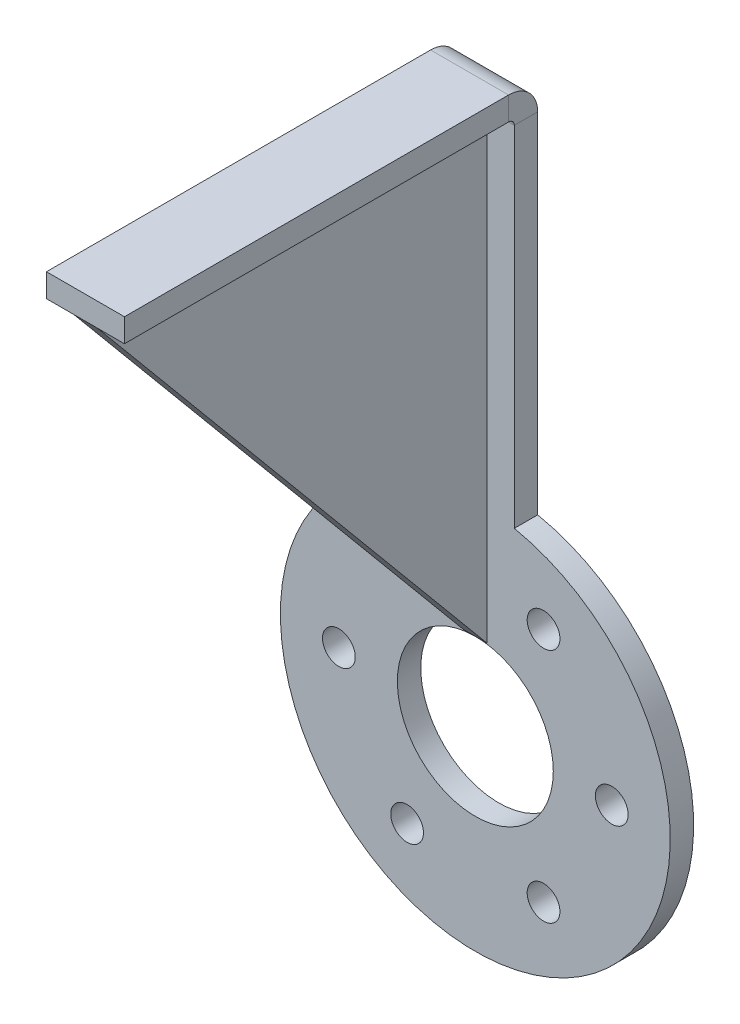
ISO-10303-21;
HEADER;
FILE_DESCRIPTION(('STEP AP214'),'2;1');
FILE_NAME('part.step','',(''),(''),'','','');
FILE_SCHEMA(('AUTOMOTIVE_DESIGN { 1 0 10303 214 1 1 1 1 }'));
ENDSEC;
DATA;
#1=APPLICATION_CONTEXT('core data for automotive mechanical design processes');
#2=APPLICATION_PROTOCOL_DEFINITION('international standard','automotive_design',2000,#1);
#3=PRODUCT_CONTEXT('',#1,'mechanical');
#4=PRODUCT('Part','Part','',(#3));
#5=PRODUCT_RELATED_PRODUCT_CATEGORY('part','',(#4));
#6=PRODUCT_DEFINITION_FORMATION('','',#4);
#7=PRODUCT_DEFINITION_CONTEXT('part definition',#1,'design');
#8=PRODUCT_DEFINITION('design','',#6,#7);
#9=PRODUCT_DEFINITION_SHAPE('','',#8);
#10=(LENGTH_UNIT() NAMED_UNIT(*) SI_UNIT(.MILLI.,.METRE.));
#11=(NAMED_UNIT(*) PLANE_ANGLE_UNIT() SI_UNIT($,.RADIAN.));
#12=(NAMED_UNIT(*) SI_UNIT($,.STERADIAN.) SOLID_ANGLE_UNIT());
#13=UNCERTAINTY_MEASURE_WITH_UNIT(LENGTH_MEASURE(1.E-05),#10,'distance_accuracy_value','');
#14=(GEOMETRIC_REPRESENTATION_CONTEXT(3) GLOBAL_UNCERTAINTY_ASSIGNED_CONTEXT((#13)) GLOBAL_UNIT_ASSIGNED_CONTEXT((#10,
#11,#12)) REPRESENTATION_CONTEXT('',''));
#15=CARTESIAN_POINT('',(0.,0.,0.));
#16=DIRECTION('',(0.,0.,1.));
#17=DIRECTION('',(1.,0.,0.));
#18=AXIS2_PLACEMENT_3D('',#15,#16,#17);
#19=CARTESIAN_POINT('',(0.,0.,0.));
#20=DIRECTION('',(0.,0.,1.));
#21=DIRECTION('',(1.,0.,0.));
#22=AXIS2_PLACEMENT_3D('',#19,#20,#21);
#23=PLANE('',#22);
#24=CARTESIAN_POINT('',(8.75000000000018,-15.1554445662276,0.));
#25=DIRECTION('',(0.,0.,1.));
#26=DIRECTION('',(1.,0.,0.));
#27=AXIS2_PLACEMENT_3D('',#24,#25,#26);
#28=CIRCLE('',#27,2.09999999999999);
#29=CARTESIAN_POINT('',(10.8500000000002,-15.1554445662276,0.));
#30=VERTEX_POINT('',#29);
#31=EDGE_CURVE('E324',#30,#30,#28,.T.);
#32=ORIENTED_EDGE('',*,*,#31,.F.);
#33=EDGE_LOOP('',(#32));
#34=FACE_BOUND('',#33,.T.);
#35=CARTESIAN_POINT('',(-8.74999999999986,-15.1554445662278,0.));
#36=DIRECTION('',(0.,0.,1.));
#37=DIRECTION('',(1.,0.,0.));
#38=AXIS2_PLACEMENT_3D('',#35,#36,#37);
#39=CIRCLE('',#38,2.09999999999999);
#40=CARTESIAN_POINT('',(-6.64999999999987,-15.1554445662278,0.));
#41=VERTEX_POINT('',#40);
#42=EDGE_CURVE('E318',#41,#41,#39,.T.);
#43=ORIENTED_EDGE('',*,*,#42,.F.);
#44=EDGE_LOOP('',(#43));
#45=FACE_BOUND('',#44,.T.);
#46=CARTESIAN_POINT('',(-17.5,0.,0.));
#47=DIRECTION('',(0.,0.,1.));
#48=DIRECTION('',(1.,0.,0.));
#49=AXIS2_PLACEMENT_3D('',#46,#47,#48);
#50=CIRCLE('',#49,2.09999999999999);
#51=CARTESIAN_POINT('',(-15.4,0.,0.));
#52=VERTEX_POINT('',#51);
#53=EDGE_CURVE('E312',#52,#52,#50,.T.);
#54=ORIENTED_EDGE('',*,*,#53,.F.);
#55=EDGE_LOOP('',(#54));
#56=FACE_BOUND('',#55,.T.);
#57=CARTESIAN_POINT('',(-8.75000000000007,15.1554445662276,0.));
#58=DIRECTION('',(0.,0.,1.));
#59=DIRECTION('',(1.,0.,0.));
#60=AXIS2_PLACEMENT_3D('',#57,#58,#59);
#61=CIRCLE('',#60,2.09999999999999);
#62=CARTESIAN_POINT('',(-6.65000000000009,15.1554445662276,0.));
#63=VERTEX_POINT('',#62);
#64=EDGE_CURVE('E306',#63,#63,#61,.T.);
#65=ORIENTED_EDGE('',*,*,#64,.F.);
#66=EDGE_LOOP('',(#65));
#67=FACE_BOUND('',#66,.T.);
#68=CARTESIAN_POINT('',(8.74999999999996,15.1554445662277,0.));
#69=DIRECTION('',(0.,0.,1.));
#70=DIRECTION('',(1.,0.,0.));
#71=AXIS2_PLACEMENT_3D('',#68,#69,#70);
#72=CIRCLE('',#71,2.09999999999999);
#73=CARTESIAN_POINT('',(10.85,15.1554445662277,0.));
#74=VERTEX_POINT('',#73);
#75=EDGE_CURVE('E300',#74,#74,#72,.T.);
#76=ORIENTED_EDGE('',*,*,#75,.F.);
#77=EDGE_LOOP('',(#76));
#78=FACE_BOUND('',#77,.T.);
#79=CARTESIAN_POINT('',(17.5,0.,0.));
#80=DIRECTION('',(0.,0.,1.));
#81=DIRECTION('',(1.,0.,0.));
#82=AXIS2_PLACEMENT_3D('',#79,#80,#81);
#83=CIRCLE('',#82,2.09999999999999);
#84=CARTESIAN_POINT('',(19.6,0.,0.));
#85=VERTEX_POINT('',#84);
#86=EDGE_CURVE('E289',#85,#85,#83,.T.);
#87=ORIENTED_EDGE('',*,*,#86,.F.);
#88=EDGE_LOOP('',(#87));
#89=FACE_BOUND('',#88,.T.);
#90=DIRECTION('',(0.,1.,0.));
#91=VECTOR('',#90,1.);
#92=CARTESIAN_POINT('',(4.99999999999999,70.,0.));
#93=LINE('',#92,#91);
#94=CARTESIAN_POINT('',(4.99999999999999,24.4948974278318,0.));
#95=VERTEX_POINT('',#94);
#96=CARTESIAN_POINT('',(4.99999999999999,69.2634,0.));
#97=VERTEX_POINT('',#96);
#98=EDGE_CURVE('E231',#95,#97,#93,.T.);
#99=ORIENTED_EDGE('',*,*,#98,.T.);
#100=DIRECTION('',(-1.,0.,0.));
#101=VECTOR('',#100,1.);
#102=CARTESIAN_POINT('',(-5.00000000000001,69.2634,0.));
#103=LINE('',#102,#101);
#104=CARTESIAN_POINT('',(-5.00000000000001,69.2634,0.));
#105=VERTEX_POINT('',#104);
#106=EDGE_CURVE('E211',#105,#97,#103,.F.);
#107=ORIENTED_EDGE('',*,*,#106,.F.);
#108=DIRECTION('',(0.,-1.,0.));
#109=VECTOR('',#108,1.);
#110=CARTESIAN_POINT('',(-5.00000000000001,70.,0.));
#111=LINE('',#110,#109);
#112=CARTESIAN_POINT('',(-5.,24.4948974278318,0.));
#113=VERTEX_POINT('',#112);
#114=EDGE_CURVE('E225',#105,#113,#111,.T.);
#115=ORIENTED_EDGE('',*,*,#114,.T.);
#116=CARTESIAN_POINT('',(0.,0.,0.));
#117=DIRECTION('',(0.,0.,1.));
#118=DIRECTION('',(1.,0.,0.));
#119=AXIS2_PLACEMENT_3D('',#116,#117,#118);
#120=CIRCLE('',#119,25.);
#121=EDGE_CURVE('E238',#113,#95,#120,.T.);
#122=ORIENTED_EDGE('',*,*,#121,.T.);
#123=EDGE_LOOP('',(#99,#107,#115,#122));
#124=FACE_BOUND('',#123,.T.);
#125=DIRECTION('',(1.,0.,0.));
#126=VECTOR('',#125,1.);
#127=CARTESIAN_POINT('',(-1.50000000000001,10.0000000000002,0.));
#128=LINE('',#127,#126);
#129=CARTESIAN_POINT('',(-1.50000000000001,10.0000000000002,0.));
#130=VERTEX_POINT('',#129);
#131=CARTESIAN_POINT('',(0.,10.,0.));
#132=VERTEX_POINT('',#131);
#133=EDGE_CURVE('E60',#130,#132,#128,.T.);
#134=ORIENTED_EDGE('',*,*,#133,.F.);
#135=DIRECTION('',(0.,1.,0.));
#136=VECTOR('',#135,1.);
#137=CARTESIAN_POINT('',(-1.50000000000001,10.0000000000002,0.));
#138=LINE('',#137,#136);
#139=CARTESIAN_POINT('',(-1.50000000000001,69.2600000000002,0.));
#140=VERTEX_POINT('',#139);
#141=EDGE_CURVE('E64',#130,#140,#138,.T.);
#142=ORIENTED_EDGE('',*,*,#141,.T.);
#143=DIRECTION('',(1.,0.,0.));
#144=VECTOR('',#143,1.);
#145=CARTESIAN_POINT('',(-1.50000000000001,69.2600000000002,0.));
#146=LINE('',#145,#144);
#147=CARTESIAN_POINT('',(1.49999999999999,69.2600000000002,0.));
#148=VERTEX_POINT('',#147);
#149=EDGE_CURVE('E141',#140,#148,#146,.T.);
#150=ORIENTED_EDGE('',*,*,#149,.T.);
#151=DIRECTION('',(0.,1.,0.));
#152=VECTOR('',#151,1.);
#153=CARTESIAN_POINT('',(1.49999999999999,10.0000000000002,0.));
#154=LINE('',#153,#152);
#155=CARTESIAN_POINT('',(1.49999999999999,10.0000000000002,0.));
#156=VERTEX_POINT('',#155);
#157=EDGE_CURVE('E283',#156,#148,#154,.T.);
#158=ORIENTED_EDGE('',*,*,#157,.F.);
#159=EDGE_CURVE('E153',#132,#156,#128,.T.);
#160=ORIENTED_EDGE('',*,*,#159,.F.);
#161=CARTESIAN_POINT('',(0.,0.,0.));
#162=DIRECTION('',(0.,0.,1.));
#163=DIRECTION('',(1.,0.,0.));
#164=AXIS2_PLACEMENT_3D('',#161,#162,#163);
#165=CIRCLE('',#164,10.);
#166=EDGE_CURVE('E219',#132,#132,#165,.T.);
#167=ORIENTED_EDGE('',*,*,#166,.F.);
#168=EDGE_LOOP('',(#134,#142,#150,#158,#160,#167));
#169=FACE_BOUND('',#168,.T.);
#170=ADVANCED_FACE('F45',(#34,#45,#56,#67,#78,#89,#124,#169),#23,.T.);
#171=CARTESIAN_POINT('',(0.,70.,-2.52575738102223E-13));
#172=DIRECTION('',(0.,-1.,0.));
#173=DIRECTION('',(0.,0.,-1.));
#174=AXIS2_PLACEMENT_3D('',#171,#172,#173);
#175=PLANE('',#174);
#176=DIRECTION('',(1.,0.,0.));
#177=VECTOR('',#176,1.);
#178=CARTESIAN_POINT('',(-1.50000000000001,70.0000000000002,0.740000000000005));
#179=LINE('',#178,#177);
#180=CARTESIAN_POINT('',(-1.50000000000001,70.0000000000002,0.740000000000005));
#181=VERTEX_POINT('',#180);
#182=CARTESIAN_POINT('',(1.49999999999999,70.0000000000002,0.740000000000005));
#183=VERTEX_POINT('',#182);
#184=EDGE_CURVE('E139',#181,#183,#179,.T.);
#185=ORIENTED_EDGE('',*,*,#184,.F.);
#186=DIRECTION('',(0.,0.,1.));
#187=VECTOR('',#186,1.);
#188=CARTESIAN_POINT('',(-1.50000000000001,70.0000000000002,50.));
#189=LINE('',#188,#187);
#190=CARTESIAN_POINT('',(-1.50000000000001,70.0000000000002,50.));
#191=VERTEX_POINT('',#190);
#192=EDGE_CURVE('E143',#181,#191,#189,.T.);
#193=ORIENTED_EDGE('',*,*,#192,.T.);
#194=DIRECTION('',(1.,0.,0.));
#195=VECTOR('',#194,1.);
#196=CARTESIAN_POINT('',(4.99999999999999,70.0000000000002,50.));
#197=LINE('',#196,#195);
#198=CARTESIAN_POINT('',(-5.00000000000001,70.0000000000002,50.));
#199=VERTEX_POINT('',#198);
#200=EDGE_CURVE('E182',#199,#191,#197,.T.);
#201=ORIENTED_EDGE('',*,*,#200,.F.);
#202=DIRECTION('',(0.,0.,1.));
#203=VECTOR('',#202,1.);
#204=CARTESIAN_POINT('',(-5.00000000000001,70.0000000000002,50.));
#205=LINE('',#204,#203);
#206=CARTESIAN_POINT('',(-5.00000000000001,70.,0.736600000000004));
#207=VERTEX_POINT('',#206);
#208=EDGE_CURVE('E189',#207,#199,#205,.T.);
#209=ORIENTED_EDGE('',*,*,#208,.F.);
#210=DIRECTION('',(-1.,0.,0.));
#211=VECTOR('',#210,1.);
#212=CARTESIAN_POINT('',(4.99999999999999,70.,0.736600000000004));
#213=LINE('',#212,#211);
#214=CARTESIAN_POINT('',(4.99999999999999,70.,0.736600000000004));
#215=VERTEX_POINT('',#214);
#216=EDGE_CURVE('E168',#215,#207,#213,.T.);
#217=ORIENTED_EDGE('',*,*,#216,.F.);
#218=DIRECTION('',(0.,0.,-1.));
#219=VECTOR('',#218,1.);
#220=CARTESIAN_POINT('',(4.99999999999999,70.,0.));
#221=LINE('',#220,#219);
#222=CARTESIAN_POINT('',(4.99999999999999,70.0000000000002,50.));
#223=VERTEX_POINT('',#222);
#224=EDGE_CURVE('E177',#223,#215,#221,.T.);
#225=ORIENTED_EDGE('',*,*,#224,.F.);
#226=CARTESIAN_POINT('',(1.49999999999999,70.0000000000002,50.));
#227=VERTEX_POINT('',#226);
#228=EDGE_CURVE('E191',#227,#223,#197,.T.);
#229=ORIENTED_EDGE('',*,*,#228,.F.);
#230=DIRECTION('',(0.,0.,1.));
#231=VECTOR('',#230,1.);
#232=CARTESIAN_POINT('',(1.49999999999999,70.0000000000002,50.));
#233=LINE('',#232,#231);
#234=EDGE_CURVE('E158',#183,#227,#233,.T.);
#235=ORIENTED_EDGE('',*,*,#234,.F.);
#236=EDGE_LOOP('',(#185,#193,#201,#209,#217,#225,#229,#235));
#237=FACE_BOUND('',#236,.T.);
#238=ADVANCED_FACE('F156',(#237),#175,.T.);
#239=CARTESIAN_POINT('',(-5.00000000000001,70.,-3.));
#240=DIRECTION('',(-1.,0.,0.));
#241=DIRECTION('',(0.,0.,1.));
#242=AXIS2_PLACEMENT_3D('',#239,#240,#241);
#243=PLANE('',#242);
#244=ORIENTED_EDGE('',*,*,#114,.F.);
#245=DIRECTION('',(0.,0.,-1.));
#246=VECTOR('',#245,1.);
#247=CARTESIAN_POINT('',(-5.00000000000001,69.2634,0.));
#248=LINE('',#247,#246);
#249=CARTESIAN_POINT('',(-5.00000000000001,69.2634,-3.));
#250=VERTEX_POINT('',#249);
#251=EDGE_CURVE('E205',#105,#250,#248,.T.);
#252=ORIENTED_EDGE('',*,*,#251,.T.);
#253=DIRECTION('',(0.,-1.,0.));
#254=VECTOR('',#253,1.);
#255=CARTESIAN_POINT('',(-5.00000000000001,70.,-3.));
#256=LINE('',#255,#254);
#257=CARTESIAN_POINT('',(-5.,24.4948974278318,-3.));
#258=VERTEX_POINT('',#257);
#259=EDGE_CURVE('E228',#250,#258,#256,.T.);
#260=ORIENTED_EDGE('',*,*,#259,.T.);
#261=DIRECTION('',(0.,0.,1.));
#262=VECTOR('',#261,1.);
#263=CARTESIAN_POINT('',(-5.,24.4948974278318,-3.));
#264=LINE('',#263,#262);
#265=EDGE_CURVE('E49',#258,#113,#264,.T.);
#266=ORIENTED_EDGE('',*,*,#265,.T.);
#267=EDGE_LOOP('',(#244,#252,#260,#266));
#268=FACE_BOUND('',#267,.T.);
#269=ADVANCED_FACE('F47',(#268),#243,.T.);
#270=CARTESIAN_POINT('',(0.,0.,-3.));
#271=DIRECTION('',(0.,0.,1.));
#272=DIRECTION('',(1.,0.,0.));
#273=AXIS2_PLACEMENT_3D('',#270,#271,#272);
#274=PLANE('',#273);
#275=CARTESIAN_POINT('',(8.75000000000018,-15.1554445662276,-3.));
#276=DIRECTION('',(0.,0.,1.));
#277=DIRECTION('',(1.,0.,0.));
#278=AXIS2_PLACEMENT_3D('',#275,#276,#277);
#279=CIRCLE('',#278,2.09999999999996);
#280=CARTESIAN_POINT('',(10.8500000000001,-15.1554445662276,-3.));
#281=VERTEX_POINT('',#280);
#282=EDGE_CURVE('E321',#281,#281,#279,.T.);
#283=ORIENTED_EDGE('',*,*,#282,.T.);
#284=EDGE_LOOP('',(#283));
#285=FACE_BOUND('',#284,.T.);
#286=CARTESIAN_POINT('',(-8.74999999999986,-15.1554445662278,-3.));
#287=DIRECTION('',(0.,0.,1.));
#288=DIRECTION('',(1.,0.,0.));
#289=AXIS2_PLACEMENT_3D('',#286,#287,#288);
#290=CIRCLE('',#289,2.09999999999996);
#291=CARTESIAN_POINT('',(-6.6499999999999,-15.1554445662278,-3.));
#292=VERTEX_POINT('',#291);
#293=EDGE_CURVE('E315',#292,#292,#290,.T.);
#294=ORIENTED_EDGE('',*,*,#293,.T.);
#295=EDGE_LOOP('',(#294));
#296=FACE_BOUND('',#295,.T.);
#297=CARTESIAN_POINT('',(-17.5,0.,-3.));
#298=DIRECTION('',(0.,0.,1.));
#299=DIRECTION('',(1.,0.,0.));
#300=AXIS2_PLACEMENT_3D('',#297,#298,#299);
#301=CIRCLE('',#300,2.09999999999996);
#302=CARTESIAN_POINT('',(-15.4,0.,-3.));
#303=VERTEX_POINT('',#302);
#304=EDGE_CURVE('E309',#303,#303,#301,.T.);
#305=ORIENTED_EDGE('',*,*,#304,.T.);
#306=EDGE_LOOP('',(#305));
#307=FACE_BOUND('',#306,.T.);
#308=CARTESIAN_POINT('',(-8.75000000000007,15.1554445662276,-3.));
#309=DIRECTION('',(0.,0.,1.));
#310=DIRECTION('',(1.,0.,0.));
#311=AXIS2_PLACEMENT_3D('',#308,#309,#310);
#312=CIRCLE('',#311,2.09999999999996);
#313=CARTESIAN_POINT('',(-6.65000000000011,15.1554445662276,-3.));
#314=VERTEX_POINT('',#313);
#315=EDGE_CURVE('E303',#314,#314,#312,.T.);
#316=ORIENTED_EDGE('',*,*,#315,.T.);
#317=EDGE_LOOP('',(#316));
#318=FACE_BOUND('',#317,.T.);
#319=CARTESIAN_POINT('',(8.74999999999996,15.1554445662277,-3.));
#320=DIRECTION('',(0.,0.,1.));
#321=DIRECTION('',(1.,0.,0.));
#322=AXIS2_PLACEMENT_3D('',#319,#320,#321);
#323=CIRCLE('',#322,2.09999999999996);
#324=CARTESIAN_POINT('',(10.8499999999999,15.1554445662277,-3.));
#325=VERTEX_POINT('',#324);
#326=EDGE_CURVE('E297',#325,#325,#323,.T.);
#327=ORIENTED_EDGE('',*,*,#326,.T.);
#328=EDGE_LOOP('',(#327));
#329=FACE_BOUND('',#328,.T.);
#330=CARTESIAN_POINT('',(17.5,0.,-3.));
#331=DIRECTION('',(0.,0.,1.));
#332=DIRECTION('',(1.,0.,0.));
#333=AXIS2_PLACEMENT_3D('',#330,#331,#332);
#334=CIRCLE('',#333,2.09999999999996);
#335=CARTESIAN_POINT('',(19.6,0.,-3.));
#336=VERTEX_POINT('',#335);
#337=EDGE_CURVE('E284',#336,#336,#334,.T.);
#338=ORIENTED_EDGE('',*,*,#337,.T.);
#339=EDGE_LOOP('',(#338));
#340=FACE_BOUND('',#339,.T.);
#341=CARTESIAN_POINT('',(0.,0.,-3.));
#342=DIRECTION('',(0.,0.,1.));
#343=DIRECTION('',(1.,0.,0.));
#344=AXIS2_PLACEMENT_3D('',#341,#342,#343);
#345=CIRCLE('',#344,10.);
#346=CARTESIAN_POINT('',(10.,0.,-3.));
#347=VERTEX_POINT('',#346);
#348=EDGE_CURVE('E222',#347,#347,#345,.T.);
#349=ORIENTED_EDGE('',*,*,#348,.T.);
#350=EDGE_LOOP('',(#349));
#351=FACE_BOUND('',#350,.T.);
#352=DIRECTION('',(-1.,0.,0.));
#353=VECTOR('',#352,1.);
#354=CARTESIAN_POINT('',(-5.00000000000001,69.2634,-3.));
#355=LINE('',#354,#353);
#356=CARTESIAN_POINT('',(4.99999999999999,69.2634,-3.));
#357=VERTEX_POINT('',#356);
#358=EDGE_CURVE('E199',#250,#357,#355,.F.);
#359=ORIENTED_EDGE('',*,*,#358,.T.);
#360=DIRECTION('',(0.,1.,0.));
#361=VECTOR('',#360,1.);
#362=CARTESIAN_POINT('',(4.99999999999999,70.,-3.));
#363=LINE('',#362,#361);
#364=CARTESIAN_POINT('',(4.99999999999999,24.4948974278318,-3.));
#365=VERTEX_POINT('',#364);
#366=EDGE_CURVE('E234',#365,#357,#363,.T.);
#367=ORIENTED_EDGE('',*,*,#366,.F.);
#368=CARTESIAN_POINT('',(0.,0.,-3.));
#369=DIRECTION('',(0.,0.,1.));
#370=DIRECTION('',(1.,0.,0.));
#371=AXIS2_PLACEMENT_3D('',#368,#369,#370);
#372=CIRCLE('',#371,25.);
#373=EDGE_CURVE('E230',#258,#365,#372,.T.);
#374=ORIENTED_EDGE('',*,*,#373,.F.);
#375=ORIENTED_EDGE('',*,*,#259,.F.);
#376=EDGE_LOOP('',(#359,#367,#374,#375));
#377=FACE_BOUND('',#376,.T.);
#378=ADVANCED_FACE('F391',(#285,#296,#307,#318,#329,#340,#351,#377),#274,.F.);
#379=CARTESIAN_POINT('',(4.99999999999999,70.,-3.));
#380=DIRECTION('',(1.,0.,0.));
#381=DIRECTION('',(0.,0.,-1.));
#382=AXIS2_PLACEMENT_3D('',#379,#380,#381);
#383=PLANE('',#382);
#384=DIRECTION('',(0.,0.,-1.));
#385=VECTOR('',#384,1.);
#386=CARTESIAN_POINT('',(4.99999999999999,69.2634,0.));
#387=LINE('',#386,#385);
#388=EDGE_CURVE('E216',#97,#357,#387,.T.);
#389=ORIENTED_EDGE('',*,*,#388,.F.);
#390=ORIENTED_EDGE('',*,*,#98,.F.);
#391=DIRECTION('',(0.,0.,1.));
#392=VECTOR('',#391,1.);
#393=CARTESIAN_POINT('',(4.99999999999999,24.4948974278318,-3.));
#394=LINE('',#393,#392);
#395=EDGE_CURVE('E11',#365,#95,#394,.T.);
#396=ORIENTED_EDGE('',*,*,#395,.F.);
#397=ORIENTED_EDGE('',*,*,#366,.T.);
#398=EDGE_LOOP('',(#389,#390,#396,#397));
#399=FACE_BOUND('',#398,.T.);
#400=ADVANCED_FACE('F393',(#399),#383,.T.);
#401=CARTESIAN_POINT('',(0.,0.,-3.));
#402=DIRECTION('',(0.,0.,1.));
#403=DIRECTION('',(1.,0.,0.));
#404=AXIS2_PLACEMENT_3D('',#401,#402,#403);
#405=CYLINDRICAL_SURFACE('',#404,25.);
#406=ORIENTED_EDGE('',*,*,#121,.F.);
#407=ORIENTED_EDGE('',*,*,#265,.F.);
#408=ORIENTED_EDGE('',*,*,#373,.T.);
#409=ORIENTED_EDGE('',*,*,#395,.T.);
#410=EDGE_LOOP('',(#406,#407,#408,#409));
#411=FACE_BOUND('',#410,.T.);
#412=ADVANCED_FACE('F389',(#411),#405,.T.);
#413=CARTESIAN_POINT('',(0.,0.,-3.));
#414=DIRECTION('',(0.,0.,1.));
#415=DIRECTION('',(1.,0.,0.));
#416=AXIS2_PLACEMENT_3D('',#413,#414,#415);
#417=CYLINDRICAL_SURFACE('',#416,10.);
#418=ORIENTED_EDGE('',*,*,#348,.F.);
#419=EDGE_LOOP('',(#418));
#420=FACE_BOUND('',#419,.T.);
#421=ORIENTED_EDGE('',*,*,#166,.T.);
#422=EDGE_LOOP('',(#421));
#423=FACE_BOUND('',#422,.T.);
#424=ADVANCED_FACE('F384',(#420,#423),#417,.F.);
#425=CARTESIAN_POINT('',(4.99999999999999,69.2634,0.736600000000007));
#426=DIRECTION('',(1.,0.,0.));
#427=DIRECTION('',(0.,0.,-1.));
#428=AXIS2_PLACEMENT_3D('',#425,#426,#427);
#429=PLANE('',#428);
#430=DIRECTION('',(0.,1.,0.));
#431=VECTOR('',#430,1.);
#432=CARTESIAN_POINT('',(4.99999999999999,70.,0.736600000000004));
#433=LINE('',#432,#431);
#434=CARTESIAN_POINT('',(4.99999999999999,73.,0.736599999999993));
#435=VERTEX_POINT('',#434);
#436=EDGE_CURVE('E162',#215,#435,#433,.T.);
#437=ORIENTED_EDGE('',*,*,#436,.F.);
#438=CARTESIAN_POINT('',(4.99999999999999,69.2634,0.736600000000007));
#439=DIRECTION('',(-1.,0.,0.));
#440=DIRECTION('',(0.,0.,1.));
#441=AXIS2_PLACEMENT_3D('',#438,#439,#440);
#442=CIRCLE('',#441,0.736600000000004);
#443=EDGE_CURVE('E208',#97,#215,#442,.F.);
#444=ORIENTED_EDGE('',*,*,#443,.F.);
#445=ORIENTED_EDGE('',*,*,#388,.T.);
#446=CARTESIAN_POINT('',(4.99999999999999,69.2634,0.736600000000007));
#447=DIRECTION('',(-1.,0.,0.));
#448=DIRECTION('',(0.,0.,1.));
#449=AXIS2_PLACEMENT_3D('',#446,#447,#448);
#450=CIRCLE('',#449,3.7366);
#451=EDGE_CURVE('E201',#357,#435,#450,.F.);
#452=ORIENTED_EDGE('',*,*,#451,.T.);
#453=EDGE_LOOP('',(#437,#444,#445,#452));
#454=FACE_BOUND('',#453,.T.);
#455=ADVANCED_FACE('F253',(#454),#429,.T.);
#456=CARTESIAN_POINT('',(-5.00000000000001,69.2634,0.736600000000007));
#457=DIRECTION('',(1.,0.,0.));
#458=DIRECTION('',(0.,0.,-1.));
#459=AXIS2_PLACEMENT_3D('',#456,#457,#458);
#460=PLANE('',#459);
#461=CARTESIAN_POINT('',(-5.00000000000001,69.2634,0.736600000000007));
#462=DIRECTION('',(-1.,0.,0.));
#463=DIRECTION('',(0.,0.,1.));
#464=AXIS2_PLACEMENT_3D('',#461,#462,#463);
#465=CIRCLE('',#464,0.736600000000004);
#466=EDGE_CURVE('E198',#207,#105,#465,.T.);
#467=ORIENTED_EDGE('',*,*,#466,.F.);
#468=DIRECTION('',(0.,1.,0.));
#469=VECTOR('',#468,1.);
#470=CARTESIAN_POINT('',(-5.00000000000001,70.,0.736600000000004));
#471=LINE('',#470,#469);
#472=CARTESIAN_POINT('',(-5.00000000000001,73.,0.736599999999993));
#473=VERTEX_POINT('',#472);
#474=EDGE_CURVE('E170',#207,#473,#471,.T.);
#475=ORIENTED_EDGE('',*,*,#474,.T.);
#476=CARTESIAN_POINT('',(-5.00000000000001,69.2634,0.736600000000007));
#477=DIRECTION('',(-1.,0.,0.));
#478=DIRECTION('',(0.,0.,1.));
#479=AXIS2_PLACEMENT_3D('',#476,#477,#478);
#480=CIRCLE('',#479,3.7366);
#481=EDGE_CURVE('E202',#473,#250,#480,.T.);
#482=ORIENTED_EDGE('',*,*,#481,.T.);
#483=ORIENTED_EDGE('',*,*,#251,.F.);
#484=EDGE_LOOP('',(#467,#475,#482,#483));
#485=FACE_BOUND('',#484,.T.);
#486=ADVANCED_FACE('F272',(#485),#460,.F.);
#487=CARTESIAN_POINT('',(-5.00000000000001,69.2634,0.736600000000007));
#488=DIRECTION('',(-1.,0.,0.));
#489=DIRECTION('',(0.,1.,0.));
#490=AXIS2_PLACEMENT_3D('',#487,#488,#489);
#491=CYLINDRICAL_SURFACE('',#490,3.7366);
#492=ORIENTED_EDGE('',*,*,#358,.F.);
#493=ORIENTED_EDGE('',*,*,#481,.F.);
#494=DIRECTION('',(1.,0.,0.));
#495=VECTOR('',#494,1.);
#496=CARTESIAN_POINT('',(0.,73.,0.736599999999993));
#497=LINE('',#496,#495);
#498=EDGE_CURVE('E173',#473,#435,#497,.T.);
#499=ORIENTED_EDGE('',*,*,#498,.T.);
#500=ORIENTED_EDGE('',*,*,#451,.F.);
#501=EDGE_LOOP('',(#492,#493,#499,#500));
#502=FACE_BOUND('',#501,.T.);
#503=ADVANCED_FACE('F376',(#502),#491,.T.);
#504=CARTESIAN_POINT('',(-5.00000000000001,69.2634,0.736600000000007));
#505=DIRECTION('',(-1.,0.,0.));
#506=DIRECTION('',(0.,1.,0.));
#507=AXIS2_PLACEMENT_3D('',#504,#505,#506);
#508=CYLINDRICAL_SURFACE('',#507,0.736600000000004);
#509=ORIENTED_EDGE('',*,*,#106,.T.);
#510=ORIENTED_EDGE('',*,*,#443,.T.);
#511=ORIENTED_EDGE('',*,*,#216,.T.);
#512=ORIENTED_EDGE('',*,*,#466,.T.);
#513=EDGE_LOOP('',(#509,#510,#511,#512));
#514=FACE_BOUND('',#513,.T.);
#515=ADVANCED_FACE('F249',(#514),#508,.F.);
#516=CARTESIAN_POINT('',(4.99999999999999,73.,0.));
#517=DIRECTION('',(-1.,0.,0.));
#518=DIRECTION('',(0.,0.,1.));
#519=AXIS2_PLACEMENT_3D('',#516,#517,#518);
#520=PLANE('',#519);
#521=ORIENTED_EDGE('',*,*,#436,.T.);
#522=DIRECTION('',(0.,0.,-1.));
#523=VECTOR('',#522,1.);
#524=CARTESIAN_POINT('',(4.99999999999999,73.,0.));
#525=LINE('',#524,#523);
#526=CARTESIAN_POINT('',(4.99999999999999,73.0000000000002,50.));
#527=VERTEX_POINT('',#526);
#528=EDGE_CURVE('E178',#527,#435,#525,.T.);
#529=ORIENTED_EDGE('',*,*,#528,.F.);
#530=DIRECTION('',(0.,-1.,0.));
#531=VECTOR('',#530,1.);
#532=CARTESIAN_POINT('',(4.99999999999999,73.0000000000002,50.));
#533=LINE('',#532,#531);
#534=EDGE_CURVE('E186',#527,#223,#533,.T.);
#535=ORIENTED_EDGE('',*,*,#534,.T.);
#536=ORIENTED_EDGE('',*,*,#224,.T.);
#537=EDGE_LOOP('',(#521,#529,#535,#536));
#538=FACE_BOUND('',#537,.T.);
#539=ADVANCED_FACE('F257',(#538),#520,.F.);
#540=CARTESIAN_POINT('',(-5.00000000000001,73.0000000000002,50.));
#541=DIRECTION('',(1.,0.,0.));
#542=DIRECTION('',(0.,0.,-1.));
#543=AXIS2_PLACEMENT_3D('',#540,#541,#542);
#544=PLANE('',#543);
#545=ORIENTED_EDGE('',*,*,#474,.F.);
#546=ORIENTED_EDGE('',*,*,#208,.T.);
#547=DIRECTION('',(0.,-1.,0.));
#548=VECTOR('',#547,1.);
#549=CARTESIAN_POINT('',(-5.00000000000001,73.0000000000002,50.));
#550=LINE('',#549,#548);
#551=CARTESIAN_POINT('',(-5.00000000000001,73.0000000000002,50.));
#552=VERTEX_POINT('',#551);
#553=EDGE_CURVE('E195',#552,#199,#550,.T.);
#554=ORIENTED_EDGE('',*,*,#553,.F.);
#555=DIRECTION('',(0.,0.,1.));
#556=VECTOR('',#555,1.);
#557=CARTESIAN_POINT('',(-5.00000000000001,73.0000000000002,50.));
#558=LINE('',#557,#556);
#559=EDGE_CURVE('E181',#473,#552,#558,.T.);
#560=ORIENTED_EDGE('',*,*,#559,.F.);
#561=EDGE_LOOP('',(#545,#546,#554,#560));
#562=FACE_BOUND('',#561,.T.);
#563=ADVANCED_FACE('F274',(#562),#544,.F.);
#564=CARTESIAN_POINT('',(0.,73.,-2.63050182118753E-13));
#565=DIRECTION('',(0.,-1.,0.));
#566=DIRECTION('',(0.,0.,-1.));
#567=AXIS2_PLACEMENT_3D('',#564,#565,#566);
#568=PLANE('',#567);
#569=ORIENTED_EDGE('',*,*,#498,.F.);
#570=ORIENTED_EDGE('',*,*,#559,.T.);
#571=DIRECTION('',(1.,0.,0.));
#572=VECTOR('',#571,1.);
#573=CARTESIAN_POINT('',(4.99999999999999,73.0000000000002,50.));
#574=LINE('',#573,#572);
#575=EDGE_CURVE('E184',#552,#527,#574,.T.);
#576=ORIENTED_EDGE('',*,*,#575,.T.);
#577=ORIENTED_EDGE('',*,*,#528,.T.);
#578=EDGE_LOOP('',(#569,#570,#576,#577));
#579=FACE_BOUND('',#578,.T.);
#580=ADVANCED_FACE('F261',(#579),#568,.F.);
#581=CARTESIAN_POINT('',(4.99999999999999,73.0000000000002,50.));
#582=DIRECTION('',(0.,0.,-1.));
#583=DIRECTION('',(0.,1.,0.));
#584=AXIS2_PLACEMENT_3D('',#581,#582,#583);
#585=PLANE('',#584);
#586=ORIENTED_EDGE('',*,*,#200,.T.);
#587=DIRECTION('',(1.,0.,0.));
#588=VECTOR('',#587,1.);
#589=CARTESIAN_POINT('',(-1.50000000000001,70.0000000000002,50.));
#590=LINE('',#589,#588);
#591=EDGE_CURVE('E159',#191,#227,#590,.T.);
#592=ORIENTED_EDGE('',*,*,#591,.T.);
#593=ORIENTED_EDGE('',*,*,#228,.T.);
#594=ORIENTED_EDGE('',*,*,#534,.F.);
#595=ORIENTED_EDGE('',*,*,#575,.F.);
#596=ORIENTED_EDGE('',*,*,#553,.T.);
#597=EDGE_LOOP('',(#586,#592,#593,#594,#595,#596));
#598=FACE_BOUND('',#597,.T.);
#599=ADVANCED_FACE('F267',(#598),#585,.F.);
#600=CARTESIAN_POINT('',(-1.50000000000001,70.0000000000002,50.));
#601=DIRECTION('',(0.,-0.64018439966448,0.768221279597376));
#602=DIRECTION('',(0.,-0.768221279597376,-0.64018439966448));
#603=AXIS2_PLACEMENT_3D('',#600,#601,#602);
#604=PLANE('',#603);
#605=DIRECTION('',(0.,-0.768221279597376,-0.64018439966448));
#606=VECTOR('',#605,1.);
#607=CARTESIAN_POINT('',(1.49999999999999,70.0000000000002,50.));
#608=LINE('',#607,#606);
#609=EDGE_CURVE('E280',#227,#156,#608,.T.);
#610=ORIENTED_EDGE('',*,*,#609,.F.);
#611=ORIENTED_EDGE('',*,*,#591,.F.);
#612=DIRECTION('',(0.,-0.768221279597376,-0.64018439966448));
#613=VECTOR('',#612,1.);
#614=CARTESIAN_POINT('',(-1.50000000000001,70.0000000000002,50.));
#615=LINE('',#614,#613);
#616=EDGE_CURVE('E149',#191,#130,#615,.T.);
#617=ORIENTED_EDGE('',*,*,#616,.T.);
#618=ORIENTED_EDGE('',*,*,#133,.T.);
#619=ORIENTED_EDGE('',*,*,#159,.T.);
#620=EDGE_LOOP('',(#610,#611,#617,#618,#619));
#621=FACE_BOUND('',#620,.T.);
#622=ADVANCED_FACE('F277',(#621),#604,.T.);
#623=CARTESIAN_POINT('',(-1.50000000000001,69.2600000000002,0.74));
#624=DIRECTION('',(1.,0.,0.));
#625=DIRECTION('',(0.,0.,-1.));
#626=AXIS2_PLACEMENT_3D('',#623,#624,#625);
#627=CYLINDRICAL_SURFACE('',#626,0.740000000000002);
#628=CARTESIAN_POINT('',(1.49999999999999,69.2600000000002,0.74));
#629=DIRECTION('',(1.,0.,0.));
#630=DIRECTION('',(0.,0.,-1.));
#631=AXIS2_PLACEMENT_3D('',#628,#629,#630);
#632=CIRCLE('',#631,0.740000000000002);
#633=EDGE_CURVE('E286',#148,#183,#632,.T.);
#634=ORIENTED_EDGE('',*,*,#633,.F.);
#635=ORIENTED_EDGE('',*,*,#149,.F.);
#636=CARTESIAN_POINT('',(-1.50000000000001,69.2600000000002,0.74));
#637=DIRECTION('',(1.,0.,0.));
#638=DIRECTION('',(0.,0.,-1.));
#639=AXIS2_PLACEMENT_3D('',#636,#637,#638);
#640=CIRCLE('',#639,0.740000000000002);
#641=EDGE_CURVE('E134',#140,#181,#640,.T.);
#642=ORIENTED_EDGE('',*,*,#641,.T.);
#643=ORIENTED_EDGE('',*,*,#184,.T.);
#644=EDGE_LOOP('',(#634,#635,#642,#643));
#645=FACE_BOUND('',#644,.T.);
#646=ADVANCED_FACE('F137',(#645),#627,.T.);
#647=CARTESIAN_POINT('',(-1.50000000000001,69.2600000000002,0.74));
#648=DIRECTION('',(1.,0.,0.));
#649=DIRECTION('',(0.,0.,-1.));
#650=AXIS2_PLACEMENT_3D('',#647,#648,#649);
#651=PLANE('',#650);
#652=ORIENTED_EDGE('',*,*,#616,.F.);
#653=ORIENTED_EDGE('',*,*,#192,.F.);
#654=ORIENTED_EDGE('',*,*,#641,.F.);
#655=ORIENTED_EDGE('',*,*,#141,.F.);
#656=EDGE_LOOP('',(#652,#653,#654,#655));
#657=FACE_BOUND('',#656,.T.);
#658=ADVANCED_FACE('F147',(#657),#651,.F.);
#659=CARTESIAN_POINT('',(1.49999999999999,69.2600000000002,0.74));
#660=DIRECTION('',(1.,0.,0.));
#661=DIRECTION('',(0.,0.,-1.));
#662=AXIS2_PLACEMENT_3D('',#659,#660,#661);
#663=PLANE('',#662);
#664=ORIENTED_EDGE('',*,*,#609,.T.);
#665=ORIENTED_EDGE('',*,*,#157,.T.);
#666=ORIENTED_EDGE('',*,*,#633,.T.);
#667=ORIENTED_EDGE('',*,*,#234,.T.);
#668=EDGE_LOOP('',(#664,#665,#666,#667));
#669=FACE_BOUND('',#668,.T.);
#670=ADVANCED_FACE('F346',(#669),#663,.T.);
#671=CARTESIAN_POINT('',(17.5,0.,0.));
#672=DIRECTION('',(0.,0.,1.));
#673=DIRECTION('',(1.,0.,0.));
#674=AXIS2_PLACEMENT_3D('',#671,#672,#673);
#675=CYLINDRICAL_SURFACE('',#674,2.09999999999997);
#676=ORIENTED_EDGE('',*,*,#337,.F.);
#677=EDGE_LOOP('',(#676));
#678=FACE_BOUND('',#677,.T.);
#679=ORIENTED_EDGE('',*,*,#86,.T.);
#680=EDGE_LOOP('',(#679));
#681=FACE_BOUND('',#680,.T.);
#682=ADVANCED_FACE('F343',(#678,#681),#675,.F.);
#683=CARTESIAN_POINT('',(8.74999999999996,15.1554445662277,0.));
#684=DIRECTION('',(0.,0.,1.));
#685=DIRECTION('',(1.,0.,0.));
#686=AXIS2_PLACEMENT_3D('',#683,#684,#685);
#687=CYLINDRICAL_SURFACE('',#686,2.09999999999997);
#688=ORIENTED_EDGE('',*,*,#326,.F.);
#689=EDGE_LOOP('',(#688));
#690=FACE_BOUND('',#689,.T.);
#691=ORIENTED_EDGE('',*,*,#75,.T.);
#692=EDGE_LOOP('',(#691));
#693=FACE_BOUND('',#692,.T.);
#694=ADVANCED_FACE('F345',(#690,#693),#687,.F.);
#695=CARTESIAN_POINT('',(-8.75000000000007,15.1554445662276,0.));
#696=DIRECTION('',(0.,0.,1.));
#697=DIRECTION('',(1.,0.,0.));
#698=AXIS2_PLACEMENT_3D('',#695,#696,#697);
#699=CYLINDRICAL_SURFACE('',#698,2.09999999999997);
#700=ORIENTED_EDGE('',*,*,#315,.F.);
#701=EDGE_LOOP('',(#700));
#702=FACE_BOUND('',#701,.T.);
#703=ORIENTED_EDGE('',*,*,#64,.T.);
#704=EDGE_LOOP('',(#703));
#705=FACE_BOUND('',#704,.T.);
#706=ADVANCED_FACE('F353',(#702,#705),#699,.F.);
#707=CARTESIAN_POINT('',(-17.5,0.,0.));
#708=DIRECTION('',(0.,0.,1.));
#709=DIRECTION('',(1.,0.,0.));
#710=AXIS2_PLACEMENT_3D('',#707,#708,#709);
#711=CYLINDRICAL_SURFACE('',#710,2.09999999999997);
#712=ORIENTED_EDGE('',*,*,#304,.F.);
#713=EDGE_LOOP('',(#712));
#714=FACE_BOUND('',#713,.T.);
#715=ORIENTED_EDGE('',*,*,#53,.T.);
#716=EDGE_LOOP('',(#715));
#717=FACE_BOUND('',#716,.T.);
#718=ADVANCED_FACE('F512',(#714,#717),#711,.F.);
#719=CARTESIAN_POINT('',(-8.74999999999986,-15.1554445662278,0.));
#720=DIRECTION('',(0.,0.,1.));
#721=DIRECTION('',(1.,0.,0.));
#722=AXIS2_PLACEMENT_3D('',#719,#720,#721);
#723=CYLINDRICAL_SURFACE('',#722,2.09999999999997);
#724=ORIENTED_EDGE('',*,*,#293,.F.);
#725=EDGE_LOOP('',(#724));
#726=FACE_BOUND('',#725,.T.);
#727=ORIENTED_EDGE('',*,*,#42,.T.);
#728=EDGE_LOOP('',(#727));
#729=FACE_BOUND('',#728,.T.);
#730=ADVANCED_FACE('F521',(#726,#729),#723,.F.);
#731=CARTESIAN_POINT('',(8.75000000000018,-15.1554445662276,0.));
#732=DIRECTION('',(0.,0.,1.));
#733=DIRECTION('',(1.,0.,0.));
#734=AXIS2_PLACEMENT_3D('',#731,#732,#733);
#735=CYLINDRICAL_SURFACE('',#734,2.09999999999997);
#736=ORIENTED_EDGE('',*,*,#282,.F.);
#737=EDGE_LOOP('',(#736));
#738=FACE_BOUND('',#737,.T.);
#739=ORIENTED_EDGE('',*,*,#31,.T.);
#740=EDGE_LOOP('',(#739));
#741=FACE_BOUND('',#740,.T.);
#742=ADVANCED_FACE('F328',(#738,#741),#735,.F.);
#743=CLOSED_SHELL('',(#170,#238,#269,#378,#400,#412,#424,#455,#486,#503,#515,#539,#563,#580,
#599,#622,#646,#658,#670,#682,#694,#706,#718,#730,#742));
#744=MANIFOLD_SOLID_BREP('B2',#743);
#745=ADVANCED_BREP_SHAPE_REPRESENTATION('',(#18,#744),#14);
#746=SHAPE_DEFINITION_REPRESENTATION(#9,#745);
ENDSEC;
END-ISO-10303-21;
